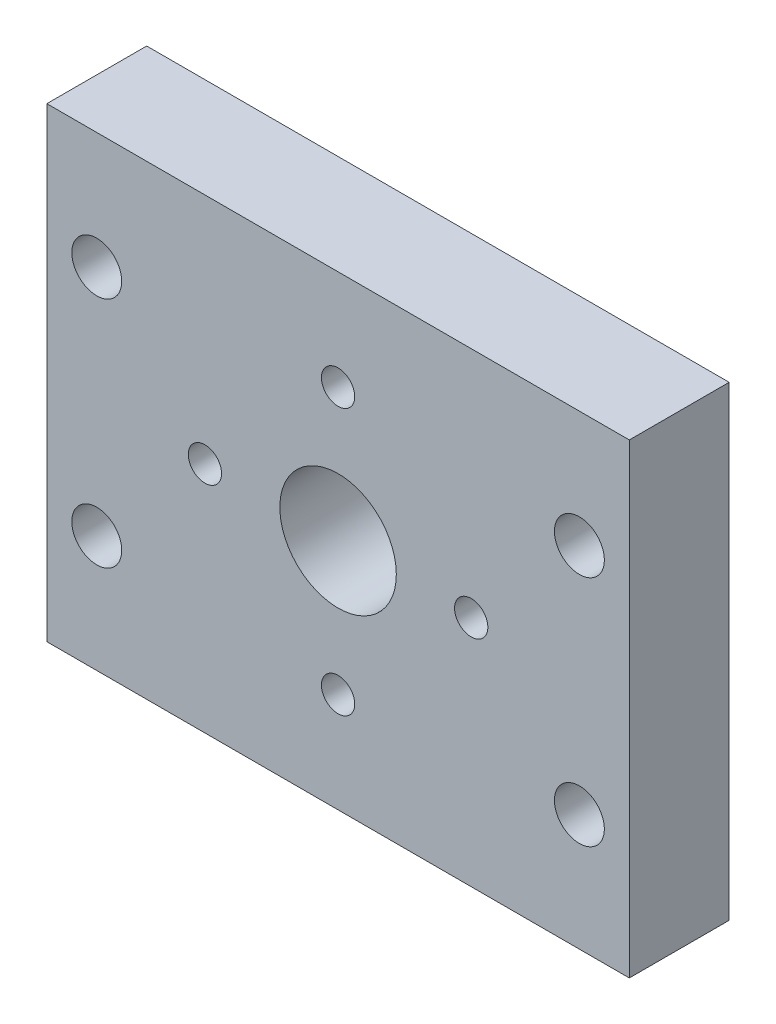
ISO-10303-21;
HEADER;
FILE_DESCRIPTION(('STEP AP214'),'2;1');
FILE_NAME('part.step','',(''),(''),'','','');
FILE_SCHEMA(('AUTOMOTIVE_DESIGN { 1 0 10303 214 1 1 1 1 }'));
ENDSEC;
DATA;
#1=APPLICATION_CONTEXT('core data for automotive mechanical design processes');
#2=APPLICATION_PROTOCOL_DEFINITION('international standard','automotive_design',2000,#1);
#3=PRODUCT_CONTEXT('',#1,'mechanical');
#4=PRODUCT('Part','Part','',(#3));
#5=PRODUCT_RELATED_PRODUCT_CATEGORY('part','',(#4));
#6=PRODUCT_DEFINITION_FORMATION('','',#4);
#7=PRODUCT_DEFINITION_CONTEXT('part definition',#1,'design');
#8=PRODUCT_DEFINITION('design','',#6,#7);
#9=PRODUCT_DEFINITION_SHAPE('','',#8);
#10=(LENGTH_UNIT() NAMED_UNIT(*) SI_UNIT(.MILLI.,.METRE.));
#11=(NAMED_UNIT(*) PLANE_ANGLE_UNIT() SI_UNIT($,.RADIAN.));
#12=(NAMED_UNIT(*) SI_UNIT($,.STERADIAN.) SOLID_ANGLE_UNIT());
#13=UNCERTAINTY_MEASURE_WITH_UNIT(LENGTH_MEASURE(1.E-05),#10,'distance_accuracy_value','');
#14=(GEOMETRIC_REPRESENTATION_CONTEXT(3) GLOBAL_UNCERTAINTY_ASSIGNED_CONTEXT((#13)) GLOBAL_UNIT_ASSIGNED_CONTEXT((#10,
#11,#12)) REPRESENTATION_CONTEXT('',''));
#15=CARTESIAN_POINT('',(0.,0.,0.));
#16=DIRECTION('',(0.,0.,1.));
#17=DIRECTION('',(1.,0.,0.));
#18=AXIS2_PLACEMENT_3D('',#15,#16,#17);
#19=CARTESIAN_POINT('',(0.,0.,6.));
#20=DIRECTION('',(0.,0.,-1.));
#21=DIRECTION('',(-1.,0.,0.));
#22=AXIS2_PLACEMENT_3D('',#19,#20,#21);
#23=PLANE('',#22);
#24=CARTESIAN_POINT('',(14.5,7.,6.));
#25=DIRECTION('',(0.,0.,-1.));
#26=DIRECTION('',(-1.,0.,0.));
#27=AXIS2_PLACEMENT_3D('',#24,#25,#26);
#28=CIRCLE('',#27,1.49999999999999);
#29=CARTESIAN_POINT('',(13.,7.,6.));
#30=VERTEX_POINT('',#29);
#31=EDGE_CURVE('E325',#30,#30,#28,.T.);
#32=ORIENTED_EDGE('',*,*,#31,.T.);
#33=EDGE_LOOP('',(#32));
#34=FACE_BOUND('',#33,.T.);
#35=CARTESIAN_POINT('',(-14.5,-7.,6.));
#36=DIRECTION('',(0.,0.,-1.));
#37=DIRECTION('',(-1.,0.,0.));
#38=AXIS2_PLACEMENT_3D('',#35,#36,#37);
#39=CIRCLE('',#38,1.5);
#40=CARTESIAN_POINT('',(-16.,-7.,6.));
#41=VERTEX_POINT('',#40);
#42=EDGE_CURVE('E319',#41,#41,#39,.T.);
#43=ORIENTED_EDGE('',*,*,#42,.T.);
#44=EDGE_LOOP('',(#43));
#45=FACE_BOUND('',#44,.T.);
#46=DIRECTION('',(-1.,0.,0.));
#47=VECTOR('',#46,1.);
#48=CARTESIAN_POINT('',(17.5,-14.,6.));
#49=LINE('',#48,#47);
#50=CARTESIAN_POINT('',(17.5,-14.,6.));
#51=VERTEX_POINT('',#50);
#52=CARTESIAN_POINT('',(-17.5,-14.,6.));
#53=VERTEX_POINT('',#52);
#54=EDGE_CURVE('E228',#51,#53,#49,.T.);
#55=ORIENTED_EDGE('',*,*,#54,.F.);
#56=DIRECTION('',(0.,1.,0.));
#57=VECTOR('',#56,1.);
#58=CARTESIAN_POINT('',(17.5,-14.,6.));
#59=LINE('',#58,#57);
#60=CARTESIAN_POINT('',(17.5,14.,6.));
#61=VERTEX_POINT('',#60);
#62=EDGE_CURVE('E218',#51,#61,#59,.T.);
#63=ORIENTED_EDGE('',*,*,#62,.T.);
#64=DIRECTION('',(-1.,0.,0.));
#65=VECTOR('',#64,1.);
#66=CARTESIAN_POINT('',(17.5,14.,6.));
#67=LINE('',#66,#65);
#68=CARTESIAN_POINT('',(-17.5,14.,6.));
#69=VERTEX_POINT('',#68);
#70=EDGE_CURVE('E213',#61,#69,#67,.T.);
#71=ORIENTED_EDGE('',*,*,#70,.T.);
#72=DIRECTION('',(0.,1.,0.));
#73=VECTOR('',#72,1.);
#74=CARTESIAN_POINT('',(-17.5,-14.,6.));
#75=LINE('',#74,#73);
#76=EDGE_CURVE('E217',#53,#69,#75,.T.);
#77=ORIENTED_EDGE('',*,*,#76,.F.);
#78=EDGE_LOOP('',(#55,#63,#71,#77));
#79=FACE_BOUND('',#78,.T.);
#80=CARTESIAN_POINT('',(0.,0.,6.));
#81=DIRECTION('',(0.,0.,1.));
#82=DIRECTION('',(1.,0.,0.));
#83=AXIS2_PLACEMENT_3D('',#80,#81,#82);
#84=CIRCLE('',#83,3.5);
#85=CARTESIAN_POINT('',(3.5,0.,6.));
#86=VERTEX_POINT('',#85);
#87=EDGE_CURVE('E238',#86,#86,#84,.T.);
#88=ORIENTED_EDGE('',*,*,#87,.F.);
#89=EDGE_LOOP('',(#88));
#90=FACE_BOUND('',#89,.T.);
#91=CARTESIAN_POINT('',(0.,8.,6.));
#92=DIRECTION('',(0.,0.,1.));
#93=DIRECTION('',(1.,0.,0.));
#94=AXIS2_PLACEMENT_3D('',#91,#92,#93);
#95=CIRCLE('',#94,1.);
#96=CARTESIAN_POINT('',(0.999999999999998,8.,6.));
#97=VERTEX_POINT('',#96);
#98=EDGE_CURVE('E283',#97,#97,#95,.T.);
#99=ORIENTED_EDGE('',*,*,#98,.F.);
#100=EDGE_LOOP('',(#99));
#101=FACE_BOUND('',#100,.T.);
#102=CARTESIAN_POINT('',(-8.,0.,6.));
#103=DIRECTION('',(0.,0.,1.));
#104=DIRECTION('',(1.,0.,0.));
#105=AXIS2_PLACEMENT_3D('',#102,#103,#104);
#106=CIRCLE('',#105,1.);
#107=CARTESIAN_POINT('',(-7.,0.,6.));
#108=VERTEX_POINT('',#107);
#109=EDGE_CURVE('E290',#108,#108,#106,.T.);
#110=ORIENTED_EDGE('',*,*,#109,.F.);
#111=EDGE_LOOP('',(#110));
#112=FACE_BOUND('',#111,.T.);
#113=CARTESIAN_POINT('',(0.,-8.,6.));
#114=DIRECTION('',(0.,0.,1.));
#115=DIRECTION('',(1.,0.,0.));
#116=AXIS2_PLACEMENT_3D('',#113,#114,#115);
#117=CIRCLE('',#116,1.);
#118=CARTESIAN_POINT('',(0.999999999999998,-8.,6.));
#119=VERTEX_POINT('',#118);
#120=EDGE_CURVE('E295',#119,#119,#117,.T.);
#121=ORIENTED_EDGE('',*,*,#120,.F.);
#122=EDGE_LOOP('',(#121));
#123=FACE_BOUND('',#122,.T.);
#124=CARTESIAN_POINT('',(8.,0.,6.));
#125=DIRECTION('',(0.,0.,1.));
#126=DIRECTION('',(1.,0.,0.));
#127=AXIS2_PLACEMENT_3D('',#124,#125,#126);
#128=CIRCLE('',#127,1.);
#129=CARTESIAN_POINT('',(9.,0.,6.));
#130=VERTEX_POINT('',#129);
#131=EDGE_CURVE('E301',#130,#130,#128,.T.);
#132=ORIENTED_EDGE('',*,*,#131,.F.);
#133=EDGE_LOOP('',(#132));
#134=FACE_BOUND('',#133,.T.);
#135=CARTESIAN_POINT('',(-14.5,7.,6.));
#136=DIRECTION('',(0.,0.,1.));
#137=DIRECTION('',(1.,0.,0.));
#138=AXIS2_PLACEMENT_3D('',#135,#136,#137);
#139=CIRCLE('',#138,1.5);
#140=CARTESIAN_POINT('',(-13.,7.,6.));
#141=VERTEX_POINT('',#140);
#142=EDGE_CURVE('E307',#141,#141,#139,.T.);
#143=ORIENTED_EDGE('',*,*,#142,.F.);
#144=EDGE_LOOP('',(#143));
#145=FACE_BOUND('',#144,.T.);
#146=CARTESIAN_POINT('',(14.5,-7.,6.));
#147=DIRECTION('',(0.,0.,1.));
#148=DIRECTION('',(1.,0.,0.));
#149=AXIS2_PLACEMENT_3D('',#146,#147,#148);
#150=CIRCLE('',#149,1.49999999999999);
#151=CARTESIAN_POINT('',(16.,-7.,6.));
#152=VERTEX_POINT('',#151);
#153=EDGE_CURVE('E313',#152,#152,#150,.T.);
#154=ORIENTED_EDGE('',*,*,#153,.F.);
#155=EDGE_LOOP('',(#154));
#156=FACE_BOUND('',#155,.T.);
#157=ADVANCED_FACE('F167',(#34,#45,#79,#90,#101,#112,#123,#134,#145,#156),#23,.F.);
#158=CARTESIAN_POINT('',(0.,0.,0.));
#159=DIRECTION('',(0.,0.,-1.));
#160=DIRECTION('',(-1.,0.,0.));
#161=AXIS2_PLACEMENT_3D('',#158,#159,#160);
#162=PLANE('',#161);
#163=CARTESIAN_POINT('',(14.5,7.,0.));
#164=DIRECTION('',(0.,0.,-1.));
#165=DIRECTION('',(-1.,0.,0.));
#166=AXIS2_PLACEMENT_3D('',#163,#164,#165);
#167=CIRCLE('',#166,1.49999999999999);
#168=CARTESIAN_POINT('',(13.,7.,0.));
#169=VERTEX_POINT('',#168);
#170=EDGE_CURVE('E328',#169,#169,#167,.T.);
#171=ORIENTED_EDGE('',*,*,#170,.F.);
#172=EDGE_LOOP('',(#171));
#173=FACE_BOUND('',#172,.T.);
#174=CARTESIAN_POINT('',(-14.5,-7.,0.));
#175=DIRECTION('',(0.,0.,-1.));
#176=DIRECTION('',(-1.,0.,0.));
#177=AXIS2_PLACEMENT_3D('',#174,#175,#176);
#178=CIRCLE('',#177,1.5);
#179=CARTESIAN_POINT('',(-16.,-7.,0.));
#180=VERTEX_POINT('',#179);
#181=EDGE_CURVE('E322',#180,#180,#178,.T.);
#182=ORIENTED_EDGE('',*,*,#181,.F.);
#183=EDGE_LOOP('',(#182));
#184=FACE_BOUND('',#183,.T.);
#185=CARTESIAN_POINT('',(-14.5,7.,0.));
#186=DIRECTION('',(0.,0.,1.));
#187=DIRECTION('',(1.,0.,0.));
#188=AXIS2_PLACEMENT_3D('',#185,#186,#187);
#189=CIRCLE('',#188,1.5);
#190=CARTESIAN_POINT('',(-13.,7.,0.));
#191=VERTEX_POINT('',#190);
#192=EDGE_CURVE('E310',#191,#191,#189,.T.);
#193=ORIENTED_EDGE('',*,*,#192,.T.);
#194=EDGE_LOOP('',(#193));
#195=FACE_BOUND('',#194,.T.);
#196=CARTESIAN_POINT('',(0.,-8.,0.));
#197=DIRECTION('',(0.,0.,1.));
#198=DIRECTION('',(1.,0.,0.));
#199=AXIS2_PLACEMENT_3D('',#196,#197,#198);
#200=CIRCLE('',#199,1.);
#201=CARTESIAN_POINT('',(0.999999999999998,-8.,0.));
#202=VERTEX_POINT('',#201);
#203=EDGE_CURVE('E298',#202,#202,#200,.T.);
#204=ORIENTED_EDGE('',*,*,#203,.T.);
#205=EDGE_LOOP('',(#204));
#206=FACE_BOUND('',#205,.T.);
#207=CARTESIAN_POINT('',(0.,8.,0.));
#208=DIRECTION('',(0.,0.,1.));
#209=DIRECTION('',(1.,0.,0.));
#210=AXIS2_PLACEMENT_3D('',#207,#208,#209);
#211=CIRCLE('',#210,1.);
#212=CARTESIAN_POINT('',(0.999999999999998,8.,0.));
#213=VERTEX_POINT('',#212);
#214=EDGE_CURVE('E286',#213,#213,#211,.T.);
#215=ORIENTED_EDGE('',*,*,#214,.T.);
#216=EDGE_LOOP('',(#215));
#217=FACE_BOUND('',#216,.T.);
#218=DIRECTION('',(-1.,0.,0.));
#219=VECTOR('',#218,1.);
#220=CARTESIAN_POINT('',(17.5,-14.,0.));
#221=LINE('',#220,#219);
#222=CARTESIAN_POINT('',(17.5,-14.,0.));
#223=VERTEX_POINT('',#222);
#224=CARTESIAN_POINT('',(-17.5,-14.,0.));
#225=VERTEX_POINT('',#224);
#226=EDGE_CURVE('E234',#223,#225,#221,.T.);
#227=ORIENTED_EDGE('',*,*,#226,.T.);
#228=DIRECTION('',(0.,1.,0.));
#229=VECTOR('',#228,1.);
#230=CARTESIAN_POINT('',(-17.5,-14.,0.));
#231=LINE('',#230,#229);
#232=CARTESIAN_POINT('',(-17.5,14.,0.));
#233=VERTEX_POINT('',#232);
#234=EDGE_CURVE('E237',#225,#233,#231,.T.);
#235=ORIENTED_EDGE('',*,*,#234,.T.);
#236=DIRECTION('',(-1.,0.,0.));
#237=VECTOR('',#236,1.);
#238=CARTESIAN_POINT('',(17.5,14.,0.));
#239=LINE('',#238,#237);
#240=CARTESIAN_POINT('',(17.5,14.,0.));
#241=VERTEX_POINT('',#240);
#242=EDGE_CURVE('E225',#241,#233,#239,.T.);
#243=ORIENTED_EDGE('',*,*,#242,.F.);
#244=DIRECTION('',(0.,1.,0.));
#245=VECTOR('',#244,1.);
#246=CARTESIAN_POINT('',(17.5,-14.,0.));
#247=LINE('',#246,#245);
#248=EDGE_CURVE('E201',#223,#241,#247,.T.);
#249=ORIENTED_EDGE('',*,*,#248,.F.);
#250=EDGE_LOOP('',(#227,#235,#243,#249));
#251=FACE_BOUND('',#250,.T.);
#252=CARTESIAN_POINT('',(0.,0.,0.));
#253=DIRECTION('',(0.,0.,1.));
#254=DIRECTION('',(1.,0.,0.));
#255=AXIS2_PLACEMENT_3D('',#252,#253,#254);
#256=CIRCLE('',#255,3.5);
#257=CARTESIAN_POINT('',(3.5,0.,0.));
#258=VERTEX_POINT('',#257);
#259=EDGE_CURVE('E282',#258,#258,#256,.T.);
#260=ORIENTED_EDGE('',*,*,#259,.T.);
#261=EDGE_LOOP('',(#260));
#262=FACE_BOUND('',#261,.T.);
#263=CARTESIAN_POINT('',(-8.,0.,0.));
#264=DIRECTION('',(0.,0.,1.));
#265=DIRECTION('',(1.,0.,0.));
#266=AXIS2_PLACEMENT_3D('',#263,#264,#265);
#267=CIRCLE('',#266,1.);
#268=CARTESIAN_POINT('',(-7.,0.,0.));
#269=VERTEX_POINT('',#268);
#270=EDGE_CURVE('E292',#269,#269,#267,.T.);
#271=ORIENTED_EDGE('',*,*,#270,.T.);
#272=EDGE_LOOP('',(#271));
#273=FACE_BOUND('',#272,.T.);
#274=CARTESIAN_POINT('',(8.,0.,0.));
#275=DIRECTION('',(0.,0.,1.));
#276=DIRECTION('',(1.,0.,0.));
#277=AXIS2_PLACEMENT_3D('',#274,#275,#276);
#278=CIRCLE('',#277,1.);
#279=CARTESIAN_POINT('',(9.,0.,0.));
#280=VERTEX_POINT('',#279);
#281=EDGE_CURVE('E304',#280,#280,#278,.T.);
#282=ORIENTED_EDGE('',*,*,#281,.T.);
#283=EDGE_LOOP('',(#282));
#284=FACE_BOUND('',#283,.T.);
#285=CARTESIAN_POINT('',(14.5,-7.,0.));
#286=DIRECTION('',(0.,0.,1.));
#287=DIRECTION('',(1.,0.,0.));
#288=AXIS2_PLACEMENT_3D('',#285,#286,#287);
#289=CIRCLE('',#288,1.49999999999999);
#290=CARTESIAN_POINT('',(16.,-7.,0.));
#291=VERTEX_POINT('',#290);
#292=EDGE_CURVE('E316',#291,#291,#289,.T.);
#293=ORIENTED_EDGE('',*,*,#292,.T.);
#294=EDGE_LOOP('',(#293));
#295=FACE_BOUND('',#294,.T.);
#296=ADVANCED_FACE('F243',(#173,#184,#195,#206,#217,#251,#262,#273,#284,#295),#162,.T.);
#297=CARTESIAN_POINT('',(17.5,-14.,6.));
#298=DIRECTION('',(0.,-1.,0.));
#299=DIRECTION('',(0.,0.,-1.));
#300=AXIS2_PLACEMENT_3D('',#297,#298,#299);
#301=PLANE('',#300);
#302=ORIENTED_EDGE('',*,*,#226,.F.);
#303=DIRECTION('',(0.,0.,-1.));
#304=VECTOR('',#303,1.);
#305=CARTESIAN_POINT('',(17.5,-14.,6.));
#306=LINE('',#305,#304);
#307=EDGE_CURVE('E12',#51,#223,#306,.T.);
#308=ORIENTED_EDGE('',*,*,#307,.F.);
#309=ORIENTED_EDGE('',*,*,#54,.T.);
#310=DIRECTION('',(0.,0.,-1.));
#311=VECTOR('',#310,1.);
#312=CARTESIAN_POINT('',(-17.5,-14.,6.));
#313=LINE('',#312,#311);
#314=EDGE_CURVE('E171',#53,#225,#313,.T.);
#315=ORIENTED_EDGE('',*,*,#314,.T.);
#316=EDGE_LOOP('',(#302,#308,#309,#315));
#317=FACE_BOUND('',#316,.T.);
#318=ADVANCED_FACE('F169',(#317),#301,.T.);
#319=CARTESIAN_POINT('',(17.5,-14.,6.));
#320=DIRECTION('',(-1.,0.,0.));
#321=DIRECTION('',(0.,0.,1.));
#322=AXIS2_PLACEMENT_3D('',#319,#320,#321);
#323=PLANE('',#322);
#324=ORIENTED_EDGE('',*,*,#248,.T.);
#325=DIRECTION('',(0.,0.,-1.));
#326=VECTOR('',#325,1.);
#327=CARTESIAN_POINT('',(17.5,14.,6.));
#328=LINE('',#327,#326);
#329=EDGE_CURVE('E177',#61,#241,#328,.T.);
#330=ORIENTED_EDGE('',*,*,#329,.F.);
#331=ORIENTED_EDGE('',*,*,#62,.F.);
#332=ORIENTED_EDGE('',*,*,#307,.T.);
#333=EDGE_LOOP('',(#324,#330,#331,#332));
#334=FACE_BOUND('',#333,.T.);
#335=ADVANCED_FACE('F246',(#334),#323,.F.);
#336=CARTESIAN_POINT('',(17.5,14.,6.));
#337=DIRECTION('',(0.,-1.,0.));
#338=DIRECTION('',(0.,0.,-1.));
#339=AXIS2_PLACEMENT_3D('',#336,#337,#338);
#340=PLANE('',#339);
#341=ORIENTED_EDGE('',*,*,#242,.T.);
#342=DIRECTION('',(0.,0.,-1.));
#343=VECTOR('',#342,1.);
#344=CARTESIAN_POINT('',(-17.5,14.,6.));
#345=LINE('',#344,#343);
#346=EDGE_CURVE('E222',#69,#233,#345,.T.);
#347=ORIENTED_EDGE('',*,*,#346,.F.);
#348=ORIENTED_EDGE('',*,*,#70,.F.);
#349=ORIENTED_EDGE('',*,*,#329,.T.);
#350=EDGE_LOOP('',(#341,#347,#348,#349));
#351=FACE_BOUND('',#350,.T.);
#352=ADVANCED_FACE('F223',(#351),#340,.F.);
#353=CARTESIAN_POINT('',(-17.5,-14.,6.));
#354=DIRECTION('',(-1.,0.,0.));
#355=DIRECTION('',(0.,0.,1.));
#356=AXIS2_PLACEMENT_3D('',#353,#354,#355);
#357=PLANE('',#356);
#358=ORIENTED_EDGE('',*,*,#234,.F.);
#359=ORIENTED_EDGE('',*,*,#314,.F.);
#360=ORIENTED_EDGE('',*,*,#76,.T.);
#361=ORIENTED_EDGE('',*,*,#346,.T.);
#362=EDGE_LOOP('',(#358,#359,#360,#361));
#363=FACE_BOUND('',#362,.T.);
#364=ADVANCED_FACE('F227',(#363),#357,.T.);
#365=CARTESIAN_POINT('',(0.,0.,6.));
#366=DIRECTION('',(0.,0.,-1.));
#367=DIRECTION('',(-1.,0.,0.));
#368=AXIS2_PLACEMENT_3D('',#365,#366,#367);
#369=CYLINDRICAL_SURFACE('',#368,3.5);
#370=ORIENTED_EDGE('',*,*,#87,.T.);
#371=EDGE_LOOP('',(#370));
#372=FACE_BOUND('',#371,.T.);
#373=ORIENTED_EDGE('',*,*,#259,.F.);
#374=EDGE_LOOP('',(#373));
#375=FACE_BOUND('',#374,.T.);
#376=ADVANCED_FACE('F262',(#372,#375),#369,.F.);
#377=CARTESIAN_POINT('',(0.,8.,6.));
#378=DIRECTION('',(0.,0.,-1.));
#379=DIRECTION('',(-1.,0.,0.));
#380=AXIS2_PLACEMENT_3D('',#377,#378,#379);
#381=CYLINDRICAL_SURFACE('',#380,1.);
#382=ORIENTED_EDGE('',*,*,#98,.T.);
#383=EDGE_LOOP('',(#382));
#384=FACE_BOUND('',#383,.T.);
#385=ORIENTED_EDGE('',*,*,#214,.F.);
#386=EDGE_LOOP('',(#385));
#387=FACE_BOUND('',#386,.T.);
#388=ADVANCED_FACE('F270',(#384,#387),#381,.F.);
#389=CARTESIAN_POINT('',(-8.,0.,6.));
#390=DIRECTION('',(0.,0.,-1.));
#391=DIRECTION('',(-1.,0.,0.));
#392=AXIS2_PLACEMENT_3D('',#389,#390,#391);
#393=CYLINDRICAL_SURFACE('',#392,1.);
#394=ORIENTED_EDGE('',*,*,#109,.T.);
#395=EDGE_LOOP('',(#394));
#396=FACE_BOUND('',#395,.T.);
#397=ORIENTED_EDGE('',*,*,#270,.F.);
#398=EDGE_LOOP('',(#397));
#399=FACE_BOUND('',#398,.T.);
#400=ADVANCED_FACE('F275',(#396,#399),#393,.F.);
#401=CARTESIAN_POINT('',(0.,-8.,6.));
#402=DIRECTION('',(0.,0.,-1.));
#403=DIRECTION('',(-1.,0.,0.));
#404=AXIS2_PLACEMENT_3D('',#401,#402,#403);
#405=CYLINDRICAL_SURFACE('',#404,1.);
#406=ORIENTED_EDGE('',*,*,#120,.T.);
#407=EDGE_LOOP('',(#406));
#408=FACE_BOUND('',#407,.T.);
#409=ORIENTED_EDGE('',*,*,#203,.F.);
#410=EDGE_LOOP('',(#409));
#411=FACE_BOUND('',#410,.T.);
#412=ADVANCED_FACE('F349',(#408,#411),#405,.F.);
#413=CARTESIAN_POINT('',(8.,0.,6.));
#414=DIRECTION('',(0.,0.,-1.));
#415=DIRECTION('',(-1.,0.,0.));
#416=AXIS2_PLACEMENT_3D('',#413,#414,#415);
#417=CYLINDRICAL_SURFACE('',#416,1.);
#418=ORIENTED_EDGE('',*,*,#131,.T.);
#419=EDGE_LOOP('',(#418));
#420=FACE_BOUND('',#419,.T.);
#421=ORIENTED_EDGE('',*,*,#281,.F.);
#422=EDGE_LOOP('',(#421));
#423=FACE_BOUND('',#422,.T.);
#424=ADVANCED_FACE('F351',(#420,#423),#417,.F.);
#425=CARTESIAN_POINT('',(-14.5,7.,6.));
#426=DIRECTION('',(0.,0.,-1.));
#427=DIRECTION('',(-1.,0.,0.));
#428=AXIS2_PLACEMENT_3D('',#425,#426,#427);
#429=CYLINDRICAL_SURFACE('',#428,1.5);
#430=ORIENTED_EDGE('',*,*,#142,.T.);
#431=EDGE_LOOP('',(#430));
#432=FACE_BOUND('',#431,.T.);
#433=ORIENTED_EDGE('',*,*,#192,.F.);
#434=EDGE_LOOP('',(#433));
#435=FACE_BOUND('',#434,.T.);
#436=ADVANCED_FACE('F358',(#432,#435),#429,.F.);
#437=CARTESIAN_POINT('',(14.5,-7.,6.));
#438=DIRECTION('',(0.,0.,-1.));
#439=DIRECTION('',(-1.,0.,0.));
#440=AXIS2_PLACEMENT_3D('',#437,#438,#439);
#441=CYLINDRICAL_SURFACE('',#440,1.49999999999999);
#442=ORIENTED_EDGE('',*,*,#153,.T.);
#443=EDGE_LOOP('',(#442));
#444=FACE_BOUND('',#443,.T.);
#445=ORIENTED_EDGE('',*,*,#292,.F.);
#446=EDGE_LOOP('',(#445));
#447=FACE_BOUND('',#446,.T.);
#448=ADVANCED_FACE('F366',(#444,#447),#441,.F.);
#449=CARTESIAN_POINT('',(-14.5,-7.,6.));
#450=DIRECTION('',(0.,0.,-1.));
#451=DIRECTION('',(-1.,0.,0.));
#452=AXIS2_PLACEMENT_3D('',#449,#450,#451);
#453=CYLINDRICAL_SURFACE('',#452,1.5);
#454=ORIENTED_EDGE('',*,*,#42,.F.);
#455=EDGE_LOOP('',(#454));
#456=FACE_BOUND('',#455,.T.);
#457=ORIENTED_EDGE('',*,*,#181,.T.);
#458=EDGE_LOOP('',(#457));
#459=FACE_BOUND('',#458,.T.);
#460=ADVANCED_FACE('F336',(#456,#459),#453,.F.);
#461=CARTESIAN_POINT('',(14.5,7.,6.));
#462=DIRECTION('',(0.,0.,-1.));
#463=DIRECTION('',(-1.,0.,0.));
#464=AXIS2_PLACEMENT_3D('',#461,#462,#463);
#465=CYLINDRICAL_SURFACE('',#464,1.49999999999999);
#466=ORIENTED_EDGE('',*,*,#31,.F.);
#467=EDGE_LOOP('',(#466));
#468=FACE_BOUND('',#467,.T.);
#469=ORIENTED_EDGE('',*,*,#170,.T.);
#470=EDGE_LOOP('',(#469));
#471=FACE_BOUND('',#470,.T.);
#472=ADVANCED_FACE('F333',(#468,#471),#465,.F.);
#473=CLOSED_SHELL('',(#157,#296,#318,#335,#352,#364,#376,#388,#400,#412,#424,#436,#448,#460,#472));
#474=MANIFOLD_SOLID_BREP('B2',#473);
#475=ADVANCED_BREP_SHAPE_REPRESENTATION('',(#18,#474),#14);
#476=SHAPE_DEFINITION_REPRESENTATION(#9,#475);
ENDSEC;
END-ISO-10303-21;
